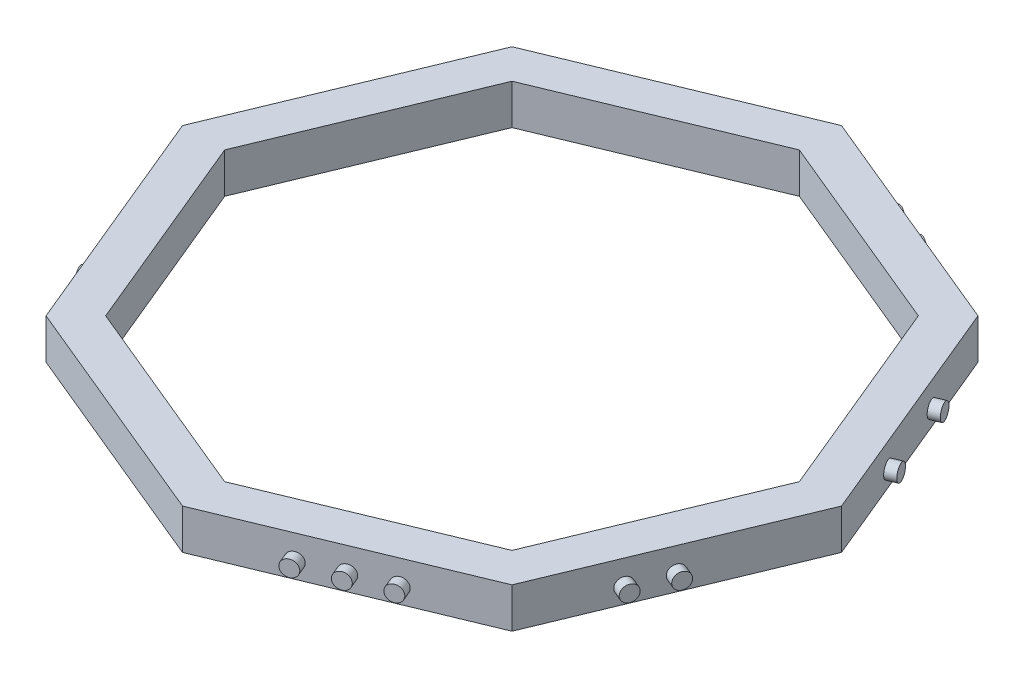
ISO-10303-21;
HEADER;
FILE_DESCRIPTION(('STEP AP214'),'2;1');
FILE_NAME('part.step','',(''),(''),'','','');
FILE_SCHEMA(('AUTOMOTIVE_DESIGN { 1 0 10303 214 1 1 1 1 }'));
ENDSEC;
DATA;
#1=APPLICATION_CONTEXT('core data for automotive mechanical design processes');
#2=APPLICATION_PROTOCOL_DEFINITION('international standard','automotive_design',2000,#1);
#3=PRODUCT_CONTEXT('',#1,'mechanical');
#4=PRODUCT('Part','Part','',(#3));
#5=PRODUCT_RELATED_PRODUCT_CATEGORY('part','',(#4));
#6=PRODUCT_DEFINITION_FORMATION('','',#4);
#7=PRODUCT_DEFINITION_CONTEXT('part definition',#1,'design');
#8=PRODUCT_DEFINITION('design','',#6,#7);
#9=PRODUCT_DEFINITION_SHAPE('','',#8);
#10=(LENGTH_UNIT() NAMED_UNIT(*) SI_UNIT(.MILLI.,.METRE.));
#11=(NAMED_UNIT(*) PLANE_ANGLE_UNIT() SI_UNIT($,.RADIAN.));
#12=(NAMED_UNIT(*) SI_UNIT($,.STERADIAN.) SOLID_ANGLE_UNIT());
#13=UNCERTAINTY_MEASURE_WITH_UNIT(LENGTH_MEASURE(1.E-05),#10,'distance_accuracy_value','');
#14=(GEOMETRIC_REPRESENTATION_CONTEXT(3) GLOBAL_UNCERTAINTY_ASSIGNED_CONTEXT((#13)) GLOBAL_UNIT_ASSIGNED_CONTEXT((#10,
#11,#12)) REPRESENTATION_CONTEXT('',''));
#15=CARTESIAN_POINT('',(0.,0.,0.));
#16=DIRECTION('',(0.,0.,1.));
#17=DIRECTION('',(1.,0.,0.));
#18=AXIS2_PLACEMENT_3D('',#15,#16,#17);
#19=CARTESIAN_POINT('',(28.9913780286488,5.,28.9913780286481));
#20=DIRECTION('',(-0.923879532511291,0.,-0.38268343236508));
#21=DIRECTION('',(-0.38268343236508,0.,0.923879532511291));
#22=AXIS2_PLACEMENT_3D('',#19,#20,#21);
#23=PLANE('',#22);
#24=CARTESIAN_POINT('',(34.9956890143244,2.,14.4956890143238));
#25=DIRECTION('',(-0.923879532511291,0.,-0.38268343236508));
#26=DIRECTION('',(-0.38268343236508,0.,0.923879532511291));
#27=AXIS2_PLACEMENT_3D('',#24,#25,#26);
#28=CIRCLE('',#27,1.);
#29=CARTESIAN_POINT('',(34.6130055819593,2.,15.4195685468351));
#30=VERTEX_POINT('',#29);
#31=EDGE_CURVE('E11',#30,#30,#28,.F.);
#32=ORIENTED_EDGE('',*,*,#31,.F.);
#33=EDGE_LOOP('',(#32));
#34=FACE_BOUND('',#33,.T.);
#35=CARTESIAN_POINT('',(33.082271852499,2.,19.1150866768803));
#36=DIRECTION('',(-0.923879532511291,0.,-0.38268343236508));
#37=DIRECTION('',(-0.38268343236508,0.,0.923879532511291));
#38=AXIS2_PLACEMENT_3D('',#35,#36,#37);
#39=CIRCLE('',#38,1.);
#40=CARTESIAN_POINT('',(32.6995884201339,2.,20.0389662093916));
#41=VERTEX_POINT('',#40);
#42=EDGE_CURVE('E40',#41,#41,#39,.F.);
#43=ORIENTED_EDGE('',*,*,#42,.F.);
#44=EDGE_LOOP('',(#43));
#45=FACE_BOUND('',#44,.T.);
#46=DIRECTION('',(0.38268343236508,0.,-0.923879532511291));
#47=VECTOR('',#46,1.);
#48=CARTESIAN_POINT('',(28.9913780286488,0.,28.9913780286481));
#49=LINE('',#48,#47);
#50=CARTESIAN_POINT('',(28.9913780286488,0.,28.9913780286481));
#51=VERTEX_POINT('',#50);
#52=CARTESIAN_POINT('',(41.,0.,-4.48023070960939E-13));
#53=VERTEX_POINT('',#52);
#54=EDGE_CURVE('E205',#51,#53,#49,.T.);
#55=ORIENTED_EDGE('',*,*,#54,.T.);
#56=DIRECTION('',(0.,-1.,0.));
#57=VECTOR('',#56,1.);
#58=CARTESIAN_POINT('',(41.,5.,-4.48023070960939E-13));
#59=LINE('',#58,#57);
#60=CARTESIAN_POINT('',(41.,5.,-4.48023070960939E-13));
#61=VERTEX_POINT('',#60);
#62=EDGE_CURVE('E271',#61,#53,#59,.T.);
#63=ORIENTED_EDGE('',*,*,#62,.F.);
#64=DIRECTION('',(0.38268343236508,0.,-0.923879532511291));
#65=VECTOR('',#64,1.);
#66=CARTESIAN_POINT('',(28.9913780286488,5.,28.9913780286481));
#67=LINE('',#66,#65);
#68=CARTESIAN_POINT('',(28.9913780286488,5.,28.9913780286481));
#69=VERTEX_POINT('',#68);
#70=EDGE_CURVE('E217',#69,#61,#67,.T.);
#71=ORIENTED_EDGE('',*,*,#70,.F.);
#72=DIRECTION('',(0.,-1.,0.));
#73=VECTOR('',#72,1.);
#74=CARTESIAN_POINT('',(28.9913780286488,5.,28.9913780286481));
#75=LINE('',#74,#73);
#76=EDGE_CURVE('E235',#69,#51,#75,.T.);
#77=ORIENTED_EDGE('',*,*,#76,.T.);
#78=EDGE_LOOP('',(#55,#63,#71,#77));
#79=FACE_BOUND('',#78,.T.);
#80=ADVANCED_FACE('F33',(#34,#45,#79),#23,.F.);
#81=CARTESIAN_POINT('',(41.,5.,-4.48023070960939E-13));
#82=DIRECTION('',(-0.923879532511283,0.,0.3826834323651));
#83=DIRECTION('',(0.3826834323651,0.,0.923879532511283));
#84=AXIS2_PLACEMENT_3D('',#81,#82,#83);
#85=PLANE('',#84);
#86=CARTESIAN_POINT('',(33.0822718524986,2.,-19.115086676881));
#87=DIRECTION('',(-0.923879532511283,0.,0.3826834323651));
#88=DIRECTION('',(0.3826834323651,0.,0.923879532511283));
#89=AXIS2_PLACEMENT_3D('',#86,#87,#88);
#90=CIRCLE('',#89,1.);
#91=CARTESIAN_POINT('',(33.4649552848637,2.,-18.1912071443697));
#92=VERTEX_POINT('',#91);
#93=EDGE_CURVE('E301',#92,#92,#90,.F.);
#94=ORIENTED_EDGE('',*,*,#93,.F.);
#95=EDGE_LOOP('',(#94));
#96=FACE_BOUND('',#95,.T.);
#97=CARTESIAN_POINT('',(36.9091061761496,2.,-9.8762913517682));
#98=DIRECTION('',(-0.923879532511283,0.,0.3826834323651));
#99=DIRECTION('',(0.3826834323651,0.,0.923879532511283));
#100=AXIS2_PLACEMENT_3D('',#97,#98,#99);
#101=CIRCLE('',#100,1.);
#102=CARTESIAN_POINT('',(37.2917896085147,2.,-8.95241181925691));
#103=VERTEX_POINT('',#102);
#104=EDGE_CURVE('E298',#103,#103,#101,.F.);
#105=ORIENTED_EDGE('',*,*,#104,.F.);
#106=EDGE_LOOP('',(#105));
#107=FACE_BOUND('',#106,.T.);
#108=DIRECTION('',(-0.3826834323651,0.,-0.923879532511283));
#109=VECTOR('',#108,1.);
#110=CARTESIAN_POINT('',(41.,0.,-4.48023070960939E-13));
#111=LINE('',#110,#109);
#112=CARTESIAN_POINT('',(28.9913780286481,0.,-28.9913780286488));
#113=VERTEX_POINT('',#112);
#114=EDGE_CURVE('E238',#53,#113,#111,.T.);
#115=ORIENTED_EDGE('',*,*,#114,.T.);
#116=DIRECTION('',(0.,-1.,0.));
#117=VECTOR('',#116,1.);
#118=CARTESIAN_POINT('',(28.9913780286481,5.,-28.9913780286488));
#119=LINE('',#118,#117);
#120=CARTESIAN_POINT('',(28.9913780286481,5.,-28.9913780286488));
#121=VERTEX_POINT('',#120);
#122=EDGE_CURVE('E268',#121,#113,#119,.T.);
#123=ORIENTED_EDGE('',*,*,#122,.F.);
#124=DIRECTION('',(-0.3826834323651,0.,-0.923879532511283));
#125=VECTOR('',#124,1.);
#126=CARTESIAN_POINT('',(41.,5.,-4.48023070960939E-13));
#127=LINE('',#126,#125);
#128=EDGE_CURVE('E220',#61,#121,#127,.T.);
#129=ORIENTED_EDGE('',*,*,#128,.F.);
#130=ORIENTED_EDGE('',*,*,#62,.T.);
#131=EDGE_LOOP('',(#115,#123,#129,#130));
#132=FACE_BOUND('',#131,.T.);
#133=ADVANCED_FACE('F310',(#96,#107,#132),#85,.F.);
#134=CARTESIAN_POINT('',(28.9913780286481,5.,-28.9913780286488));
#135=DIRECTION('',(-0.38268343236508,0.,0.923879532511291));
#136=DIRECTION('',(0.923879532511291,0.,0.38268343236508));
#137=AXIS2_PLACEMENT_3D('',#134,#135,#136);
#138=PLANE('',#137);
#139=CARTESIAN_POINT('',(9.87629135176739,2.,-36.9091061761498));
#140=DIRECTION('',(-0.38268343236508,0.,0.923879532511291));
#141=DIRECTION('',(0.923879532511291,0.,0.38268343236508));
#142=AXIS2_PLACEMENT_3D('',#139,#140,#141);
#143=CIRCLE('',#142,0.999999999999998);
#144=CARTESIAN_POINT('',(10.8001708842787,2.,-36.5264227437847));
#145=VERTEX_POINT('',#144);
#146=EDGE_CURVE('E295',#145,#145,#143,.F.);
#147=ORIENTED_EDGE('',*,*,#146,.F.);
#148=EDGE_LOOP('',(#147));
#149=FACE_BOUND('',#148,.T.);
#150=CARTESIAN_POINT('',(14.4956890143238,2.,-34.9956890143244));
#151=DIRECTION('',(-0.38268343236508,0.,0.923879532511291));
#152=DIRECTION('',(0.923879532511291,0.,0.38268343236508));
#153=AXIS2_PLACEMENT_3D('',#150,#151,#152);
#154=CIRCLE('',#153,1.);
#155=CARTESIAN_POINT('',(15.4195685468351,2.,-34.6130055819593));
#156=VERTEX_POINT('',#155);
#157=EDGE_CURVE('E292',#156,#156,#154,.F.);
#158=ORIENTED_EDGE('',*,*,#157,.F.);
#159=EDGE_LOOP('',(#158));
#160=FACE_BOUND('',#159,.T.);
#161=DIRECTION('',(-0.923879532511291,0.,-0.38268343236508));
#162=VECTOR('',#161,1.);
#163=CARTESIAN_POINT('',(28.9913780286481,0.,-28.9913780286488));
#164=LINE('',#163,#162);
#165=CARTESIAN_POINT('',(-4.51771650624012E-13,0.,-41.));
#166=VERTEX_POINT('',#165);
#167=EDGE_CURVE('E240',#113,#166,#164,.T.);
#168=ORIENTED_EDGE('',*,*,#167,.T.);
#169=DIRECTION('',(0.,-1.,0.));
#170=VECTOR('',#169,1.);
#171=CARTESIAN_POINT('',(-4.51771650624012E-13,5.,-41.));
#172=LINE('',#171,#170);
#173=CARTESIAN_POINT('',(-4.51771650624012E-13,5.,-41.));
#174=VERTEX_POINT('',#173);
#175=EDGE_CURVE('E265',#174,#166,#172,.T.);
#176=ORIENTED_EDGE('',*,*,#175,.F.);
#177=DIRECTION('',(-0.923879532511291,0.,-0.38268343236508));
#178=VECTOR('',#177,1.);
#179=CARTESIAN_POINT('',(28.9913780286481,5.,-28.9913780286488));
#180=LINE('',#179,#178);
#181=EDGE_CURVE('E223',#121,#174,#180,.T.);
#182=ORIENTED_EDGE('',*,*,#181,.F.);
#183=ORIENTED_EDGE('',*,*,#122,.T.);
#184=EDGE_LOOP('',(#168,#176,#182,#183));
#185=FACE_BOUND('',#184,.T.);
#186=ADVANCED_FACE('F348',(#149,#160,#185),#138,.F.);
#187=CARTESIAN_POINT('',(-4.51771650624012E-13,5.,-41.));
#188=DIRECTION('',(0.3826834323651,0.,0.923879532511283));
#189=DIRECTION('',(0.923879532511283,0.,-0.3826834323651));
#190=AXIS2_PLACEMENT_3D('',#187,#188,#189);
#191=PLANE('',#190);
#192=CARTESIAN_POINT('',(-9.8762913517682,2.,-36.9091061761496));
#193=DIRECTION('',(0.3826834323651,0.,0.923879532511283));
#194=DIRECTION('',(0.923879532511283,0.,-0.3826834323651));
#195=AXIS2_PLACEMENT_3D('',#192,#193,#194);
#196=CIRCLE('',#195,1.);
#197=CARTESIAN_POINT('',(-8.95241181925692,2.,-37.2917896085147));
#198=VERTEX_POINT('',#197);
#199=EDGE_CURVE('E289',#198,#198,#196,.F.);
#200=ORIENTED_EDGE('',*,*,#199,.F.);
#201=EDGE_LOOP('',(#200));
#202=FACE_BOUND('',#201,.T.);
#203=DIRECTION('',(-0.923879532511283,0.,0.3826834323651));
#204=VECTOR('',#203,1.);
#205=CARTESIAN_POINT('',(-4.51771650624012E-13,0.,-41.));
#206=LINE('',#205,#204);
#207=CARTESIAN_POINT('',(-28.9913780286488,0.,-28.9913780286481));
#208=VERTEX_POINT('',#207);
#209=EDGE_CURVE('E242',#166,#208,#206,.T.);
#210=ORIENTED_EDGE('',*,*,#209,.T.);
#211=DIRECTION('',(0.,-1.,0.));
#212=VECTOR('',#211,1.);
#213=CARTESIAN_POINT('',(-28.9913780286488,5.,-28.9913780286481));
#214=LINE('',#213,#212);
#215=CARTESIAN_POINT('',(-28.9913780286488,5.,-28.9913780286481));
#216=VERTEX_POINT('',#215);
#217=EDGE_CURVE('E262',#216,#208,#214,.T.);
#218=ORIENTED_EDGE('',*,*,#217,.F.);
#219=DIRECTION('',(-0.923879532511283,0.,0.3826834323651));
#220=VECTOR('',#219,1.);
#221=CARTESIAN_POINT('',(-4.51771650624012E-13,5.,-41.));
#222=LINE('',#221,#220);
#223=EDGE_CURVE('E225',#174,#216,#222,.T.);
#224=ORIENTED_EDGE('',*,*,#223,.F.);
#225=ORIENTED_EDGE('',*,*,#175,.T.);
#226=EDGE_LOOP('',(#210,#218,#224,#225));
#227=FACE_BOUND('',#226,.T.);
#228=ADVANCED_FACE('F345',(#202,#227),#191,.F.);
#229=CARTESIAN_POINT('',(-28.9913780286488,5.,-28.9913780286481));
#230=DIRECTION('',(0.923879532511291,0.,0.38268343236508));
#231=DIRECTION('',(0.38268343236508,0.,-0.923879532511291));
#232=AXIS2_PLACEMENT_3D('',#229,#230,#231);
#233=PLANE('',#232);
#234=CARTESIAN_POINT('',(-34.9956890143244,2.,-14.4956890143239));
#235=DIRECTION('',(0.923879532511291,0.,0.38268343236508));
#236=DIRECTION('',(0.38268343236508,0.,-0.923879532511291));
#237=AXIS2_PLACEMENT_3D('',#234,#235,#236);
#238=CIRCLE('',#237,0.999999999999998);
#239=CARTESIAN_POINT('',(-34.6130055819593,2.,-15.4195685468351));
#240=VERTEX_POINT('',#239);
#241=EDGE_CURVE('E286',#240,#240,#238,.F.);
#242=ORIENTED_EDGE('',*,*,#241,.F.);
#243=EDGE_LOOP('',(#242));
#244=FACE_BOUND('',#243,.T.);
#245=DIRECTION('',(-0.38268343236508,0.,0.923879532511291));
#246=VECTOR('',#245,1.);
#247=CARTESIAN_POINT('',(-28.9913780286488,0.,-28.9913780286481));
#248=LINE('',#247,#246);
#249=CARTESIAN_POINT('',(-41.,0.,4.3736829323662E-13));
#250=VERTEX_POINT('',#249);
#251=EDGE_CURVE('E244',#208,#250,#248,.T.);
#252=ORIENTED_EDGE('',*,*,#251,.T.);
#253=DIRECTION('',(0.,-1.,0.));
#254=VECTOR('',#253,1.);
#255=CARTESIAN_POINT('',(-41.,5.,4.3736829323662E-13));
#256=LINE('',#255,#254);
#257=CARTESIAN_POINT('',(-41.,5.,4.3736829323662E-13));
#258=VERTEX_POINT('',#257);
#259=EDGE_CURVE('E259',#258,#250,#256,.T.);
#260=ORIENTED_EDGE('',*,*,#259,.F.);
#261=DIRECTION('',(-0.38268343236508,0.,0.923879532511291));
#262=VECTOR('',#261,1.);
#263=CARTESIAN_POINT('',(-28.9913780286488,5.,-28.9913780286481));
#264=LINE('',#263,#262);
#265=EDGE_CURVE('E227',#216,#258,#264,.T.);
#266=ORIENTED_EDGE('',*,*,#265,.F.);
#267=ORIENTED_EDGE('',*,*,#217,.T.);
#268=EDGE_LOOP('',(#252,#260,#266,#267));
#269=FACE_BOUND('',#268,.T.);
#270=ADVANCED_FACE('F341',(#244,#269),#233,.F.);
#271=CARTESIAN_POINT('',(-41.,5.,4.3736829323662E-13));
#272=DIRECTION('',(0.923879532511283,0.,-0.3826834323651));
#273=DIRECTION('',(-0.3826834323651,0.,-0.923879532511283));
#274=AXIS2_PLACEMENT_3D('',#271,#272,#273);
#275=PLANE('',#274);
#276=CARTESIAN_POINT('',(-33.0822718524986,2.,19.115086676881));
#277=DIRECTION('',(0.923879532511283,0.,-0.3826834323651));
#278=DIRECTION('',(-0.3826834323651,0.,-0.923879532511283));
#279=AXIS2_PLACEMENT_3D('',#276,#277,#278);
#280=CIRCLE('',#279,1.);
#281=CARTESIAN_POINT('',(-33.4649552848637,2.,18.1912071443697));
#282=VERTEX_POINT('',#281);
#283=EDGE_CURVE('E283',#282,#282,#280,.F.);
#284=ORIENTED_EDGE('',*,*,#283,.F.);
#285=EDGE_LOOP('',(#284));
#286=FACE_BOUND('',#285,.T.);
#287=DIRECTION('',(0.3826834323651,0.,0.923879532511283));
#288=VECTOR('',#287,1.);
#289=CARTESIAN_POINT('',(-41.,0.,4.3736829323662E-13));
#290=LINE('',#289,#288);
#291=CARTESIAN_POINT('',(-28.9913780286481,0.,28.9913780286488));
#292=VERTEX_POINT('',#291);
#293=EDGE_CURVE('E246',#250,#292,#290,.T.);
#294=ORIENTED_EDGE('',*,*,#293,.T.);
#295=DIRECTION('',(0.,-1.,0.));
#296=VECTOR('',#295,1.);
#297=CARTESIAN_POINT('',(-28.9913780286481,5.,28.9913780286488));
#298=LINE('',#297,#296);
#299=CARTESIAN_POINT('',(-28.9913780286481,5.,28.9913780286488));
#300=VERTEX_POINT('',#299);
#301=EDGE_CURVE('E256',#300,#292,#298,.T.);
#302=ORIENTED_EDGE('',*,*,#301,.F.);
#303=DIRECTION('',(0.3826834323651,0.,0.923879532511283));
#304=VECTOR('',#303,1.);
#305=CARTESIAN_POINT('',(-41.,5.,4.3736829323662E-13));
#306=LINE('',#305,#304);
#307=EDGE_CURVE('E229',#258,#300,#306,.T.);
#308=ORIENTED_EDGE('',*,*,#307,.F.);
#309=ORIENTED_EDGE('',*,*,#259,.T.);
#310=EDGE_LOOP('',(#294,#302,#308,#309));
#311=FACE_BOUND('',#310,.T.);
#312=ADVANCED_FACE('F336',(#286,#311),#275,.F.);
#313=CARTESIAN_POINT('',(-28.9913780286481,5.,28.9913780286488));
#314=DIRECTION('',(0.382683432365079,0.,-0.923879532511291));
#315=DIRECTION('',(-0.923879532511291,0.,-0.382683432365079));
#316=AXIS2_PLACEMENT_3D('',#313,#314,#315);
#317=PLANE('',#316);
#318=DIRECTION('',(0.923879532511291,0.,0.382683432365079));
#319=VECTOR('',#318,1.);
#320=CARTESIAN_POINT('',(-28.9913780286481,0.,28.9913780286488));
#321=LINE('',#320,#319);
#322=CARTESIAN_POINT('',(4.40747933146162E-13,0.,41.));
#323=VERTEX_POINT('',#322);
#324=EDGE_CURVE('E248',#292,#323,#321,.T.);
#325=ORIENTED_EDGE('',*,*,#324,.T.);
#326=DIRECTION('',(0.,-1.,0.));
#327=VECTOR('',#326,1.);
#328=CARTESIAN_POINT('',(4.40747933146162E-13,5.,41.));
#329=LINE('',#328,#327);
#330=CARTESIAN_POINT('',(4.40747933146162E-13,5.,41.));
#331=VERTEX_POINT('',#330);
#332=EDGE_CURVE('E253',#331,#323,#329,.T.);
#333=ORIENTED_EDGE('',*,*,#332,.F.);
#334=DIRECTION('',(0.923879532511291,0.,0.382683432365079));
#335=VECTOR('',#334,1.);
#336=CARTESIAN_POINT('',(-28.9913780286481,5.,28.9913780286488));
#337=LINE('',#336,#335);
#338=EDGE_CURVE('E231',#300,#331,#337,.T.);
#339=ORIENTED_EDGE('',*,*,#338,.F.);
#340=ORIENTED_EDGE('',*,*,#301,.T.);
#341=EDGE_LOOP('',(#325,#333,#339,#340));
#342=FACE_BOUND('',#341,.T.);
#343=ADVANCED_FACE('F331',(#342),#317,.F.);
#344=CARTESIAN_POINT('',(4.40747933146162E-13,5.,41.));
#345=DIRECTION('',(-0.3826834323651,0.,-0.923879532511283));
#346=DIRECTION('',(-0.923879532511283,0.,0.3826834323651));
#347=AXIS2_PLACEMENT_3D('',#344,#345,#346);
#348=PLANE('',#347);
#349=CARTESIAN_POINT('',(14.4956890143246,2.,34.9956890143241));
#350=DIRECTION('',(-0.3826834323651,0.,-0.923879532511283));
#351=DIRECTION('',(-0.923879532511283,0.,0.3826834323651));
#352=AXIS2_PLACEMENT_3D('',#349,#350,#351);
#353=CIRCLE('',#352,1.);
#354=CARTESIAN_POINT('',(13.5718094818133,2.,35.3783724466892));
#355=VERTEX_POINT('',#354);
#356=EDGE_CURVE('E280',#355,#355,#353,.F.);
#357=ORIENTED_EDGE('',*,*,#356,.F.);
#358=EDGE_LOOP('',(#357));
#359=FACE_BOUND('',#358,.T.);
#360=CARTESIAN_POINT('',(9.87629135176818,2.,36.9091061761496));
#361=DIRECTION('',(-0.3826834323651,0.,-0.923879532511283));
#362=DIRECTION('',(-0.923879532511283,0.,0.3826834323651));
#363=AXIS2_PLACEMENT_3D('',#360,#361,#362);
#364=CIRCLE('',#363,1.);
#365=CARTESIAN_POINT('',(8.9524118192569,2.,37.2917896085147));
#366=VERTEX_POINT('',#365);
#367=EDGE_CURVE('E277',#366,#366,#364,.F.);
#368=ORIENTED_EDGE('',*,*,#367,.F.);
#369=EDGE_LOOP('',(#368));
#370=FACE_BOUND('',#369,.T.);
#371=CARTESIAN_POINT('',(19.115086676881,2.,33.0822718524986));
#372=DIRECTION('',(-0.3826834323651,0.,-0.923879532511283));
#373=DIRECTION('',(-0.923879532511283,0.,0.3826834323651));
#374=AXIS2_PLACEMENT_3D('',#371,#372,#373);
#375=CIRCLE('',#374,1.);
#376=CARTESIAN_POINT('',(18.1912071443697,2.,33.4649552848637));
#377=VERTEX_POINT('',#376);
#378=EDGE_CURVE('E274',#377,#377,#375,.F.);
#379=ORIENTED_EDGE('',*,*,#378,.F.);
#380=EDGE_LOOP('',(#379));
#381=FACE_BOUND('',#380,.T.);
#382=DIRECTION('',(0.923879532511283,0.,-0.3826834323651));
#383=VECTOR('',#382,1.);
#384=CARTESIAN_POINT('',(4.40747933146162E-13,0.,41.));
#385=LINE('',#384,#383);
#386=EDGE_CURVE('E221',#323,#51,#385,.T.);
#387=ORIENTED_EDGE('',*,*,#386,.T.);
#388=ORIENTED_EDGE('',*,*,#76,.F.);
#389=DIRECTION('',(0.923879532511283,0.,-0.3826834323651));
#390=VECTOR('',#389,1.);
#391=CARTESIAN_POINT('',(4.40747933146162E-13,5.,41.));
#392=LINE('',#391,#390);
#393=EDGE_CURVE('E233',#331,#69,#392,.T.);
#394=ORIENTED_EDGE('',*,*,#393,.F.);
#395=ORIENTED_EDGE('',*,*,#332,.T.);
#396=EDGE_LOOP('',(#387,#388,#394,#395));
#397=FACE_BOUND('',#396,.T.);
#398=ADVANCED_FACE('F329',(#359,#370,#381,#397),#348,.F.);
#399=CARTESIAN_POINT('',(0.,5.,0.));
#400=DIRECTION('',(0.,1.,0.));
#401=DIRECTION('',(0.,0.,1.));
#402=AXIS2_PLACEMENT_3D('',#399,#400,#401);
#403=PLANE('',#402);
#404=DIRECTION('',(0.382683432365079,0.,-0.923879532511291));
#405=VECTOR('',#404,1.);
#406=CARTESIAN_POINT('',(25.2790674274194,5.,25.2790674274188));
#407=LINE('',#406,#405);
#408=CARTESIAN_POINT('',(25.2790674274194,5.,25.2790674274188));
#409=VERTEX_POINT('',#408);
#410=CARTESIAN_POINT('',(35.75,5.,-4.16333634234434E-13));
#411=VERTEX_POINT('',#410);
#412=EDGE_CURVE('E47',#409,#411,#407,.T.);
#413=ORIENTED_EDGE('',*,*,#412,.F.);
#414=DIRECTION('',(0.923879532511282,0.,-0.3826834323651));
#415=VECTOR('',#414,1.);
#416=CARTESIAN_POINT('',(4.16333753560652E-13,5.,35.75));
#417=LINE('',#416,#415);
#418=CARTESIAN_POINT('',(4.16333753560652E-13,5.,35.75));
#419=VERTEX_POINT('',#418);
#420=EDGE_CURVE('E164',#419,#409,#417,.T.);
#421=ORIENTED_EDGE('',*,*,#420,.F.);
#422=DIRECTION('',(0.923879532511291,0.,0.382683432365079));
#423=VECTOR('',#422,1.);
#424=CARTESIAN_POINT('',(-25.2790674274188,5.,25.2790674274194));
#425=LINE('',#424,#423);
#426=CARTESIAN_POINT('',(-25.2790674274188,5.,25.2790674274194));
#427=VERTEX_POINT('',#426);
#428=EDGE_CURVE('E167',#427,#419,#425,.T.);
#429=ORIENTED_EDGE('',*,*,#428,.F.);
#430=DIRECTION('',(0.3826834323651,0.,0.923879532511283));
#431=VECTOR('',#430,1.);
#432=CARTESIAN_POINT('',(-35.75,5.,4.19807521561603E-13));
#433=LINE('',#432,#431);
#434=CARTESIAN_POINT('',(-35.75,5.,4.19807521561603E-13));
#435=VERTEX_POINT('',#434);
#436=EDGE_CURVE('E198',#435,#427,#433,.T.);
#437=ORIENTED_EDGE('',*,*,#436,.F.);
#438=DIRECTION('',(-0.382683432365079,0.,0.923879532511291));
#439=VECTOR('',#438,1.);
#440=CARTESIAN_POINT('',(-25.2790674274194,5.,-25.2790674274188));
#441=LINE('',#440,#439);
#442=CARTESIAN_POINT('',(-25.2790674274194,5.,-25.2790674274188));
#443=VERTEX_POINT('',#442);
#444=EDGE_CURVE('E195',#443,#435,#441,.T.);
#445=ORIENTED_EDGE('',*,*,#444,.F.);
#446=DIRECTION('',(-0.923879532511282,0.,0.3826834323651));
#447=VECTOR('',#446,1.);
#448=CARTESIAN_POINT('',(-4.23301906745794E-13,5.,-35.75));
#449=LINE('',#448,#447);
#450=CARTESIAN_POINT('',(-4.23301906745794E-13,5.,-35.75));
#451=VERTEX_POINT('',#450);
#452=EDGE_CURVE('E192',#451,#443,#449,.T.);
#453=ORIENTED_EDGE('',*,*,#452,.F.);
#454=DIRECTION('',(-0.923879532511291,0.,-0.382683432365079));
#455=VECTOR('',#454,1.);
#456=CARTESIAN_POINT('',(25.2790674274188,5.,-25.2790674274194));
#457=LINE('',#456,#455);
#458=CARTESIAN_POINT('',(25.2790674274188,5.,-25.2790674274194));
#459=VERTEX_POINT('',#458);
#460=EDGE_CURVE('E189',#459,#451,#457,.T.);
#461=ORIENTED_EDGE('',*,*,#460,.F.);
#462=DIRECTION('',(-0.3826834323651,0.,-0.923879532511282));
#463=VECTOR('',#462,1.);
#464=CARTESIAN_POINT('',(35.75,5.,-4.15771681559117E-13));
#465=LINE('',#464,#463);
#466=EDGE_CURVE('E187',#411,#459,#465,.T.);
#467=ORIENTED_EDGE('',*,*,#466,.F.);
#468=EDGE_LOOP('',(#413,#421,#429,#437,#445,#453,#461,#467));
#469=FACE_BOUND('',#468,.T.);
#470=ORIENTED_EDGE('',*,*,#70,.T.);
#471=ORIENTED_EDGE('',*,*,#128,.T.);
#472=ORIENTED_EDGE('',*,*,#181,.T.);
#473=ORIENTED_EDGE('',*,*,#223,.T.);
#474=ORIENTED_EDGE('',*,*,#265,.T.);
#475=ORIENTED_EDGE('',*,*,#307,.T.);
#476=ORIENTED_EDGE('',*,*,#338,.T.);
#477=ORIENTED_EDGE('',*,*,#393,.T.);
#478=EDGE_LOOP('',(#470,#471,#472,#473,#474,#475,#476,#477));
#479=FACE_BOUND('',#478,.T.);
#480=ADVANCED_FACE('F324',(#469,#479),#403,.T.);
#481=CARTESIAN_POINT('',(0.,0.,0.));
#482=DIRECTION('',(0.,1.,0.));
#483=DIRECTION('',(0.,0.,1.));
#484=AXIS2_PLACEMENT_3D('',#481,#482,#483);
#485=PLANE('',#484);
#486=DIRECTION('',(0.923879532511282,0.,-0.3826834323651));
#487=VECTOR('',#486,1.);
#488=CARTESIAN_POINT('',(4.16333753560652E-13,0.,35.75));
#489=LINE('',#488,#487);
#490=CARTESIAN_POINT('',(4.16333753560652E-13,0.,35.75));
#491=VERTEX_POINT('',#490);
#492=CARTESIAN_POINT('',(25.2790674274194,0.,25.2790674274188));
#493=VERTEX_POINT('',#492);
#494=EDGE_CURVE('E153',#491,#493,#489,.T.);
#495=ORIENTED_EDGE('',*,*,#494,.T.);
#496=DIRECTION('',(0.382683432365079,0.,-0.923879532511291));
#497=VECTOR('',#496,1.);
#498=CARTESIAN_POINT('',(25.2790674274194,0.,25.2790674274188));
#499=LINE('',#498,#497);
#500=CARTESIAN_POINT('',(35.75,0.,-4.15771681559117E-13));
#501=VERTEX_POINT('',#500);
#502=EDGE_CURVE('E147',#493,#501,#499,.T.);
#503=ORIENTED_EDGE('',*,*,#502,.T.);
#504=DIRECTION('',(-0.3826834323651,0.,-0.923879532511282));
#505=VECTOR('',#504,1.);
#506=CARTESIAN_POINT('',(35.75,0.,-4.15771681559117E-13));
#507=LINE('',#506,#505);
#508=CARTESIAN_POINT('',(25.2790674274188,0.,-25.2790674274194));
#509=VERTEX_POINT('',#508);
#510=EDGE_CURVE('E156',#501,#509,#507,.T.);
#511=ORIENTED_EDGE('',*,*,#510,.T.);
#512=DIRECTION('',(-0.923879532511291,0.,-0.382683432365079));
#513=VECTOR('',#512,1.);
#514=CARTESIAN_POINT('',(25.2790674274188,0.,-25.2790674274194));
#515=LINE('',#514,#513);
#516=CARTESIAN_POINT('',(-4.23301906745794E-13,0.,-35.75));
#517=VERTEX_POINT('',#516);
#518=EDGE_CURVE('E55',#509,#517,#515,.T.);
#519=ORIENTED_EDGE('',*,*,#518,.T.);
#520=DIRECTION('',(-0.923879532511282,0.,0.3826834323651));
#521=VECTOR('',#520,1.);
#522=CARTESIAN_POINT('',(-4.23301906745794E-13,0.,-35.75));
#523=LINE('',#522,#521);
#524=CARTESIAN_POINT('',(-25.2790674274194,0.,-25.2790674274188));
#525=VERTEX_POINT('',#524);
#526=EDGE_CURVE('E174',#517,#525,#523,.T.);
#527=ORIENTED_EDGE('',*,*,#526,.T.);
#528=DIRECTION('',(-0.382683432365079,0.,0.923879532511291));
#529=VECTOR('',#528,1.);
#530=CARTESIAN_POINT('',(-25.2790674274194,0.,-25.2790674274188));
#531=LINE('',#530,#529);
#532=CARTESIAN_POINT('',(-35.75,0.,4.19807521561603E-13));
#533=VERTEX_POINT('',#532);
#534=EDGE_CURVE('E177',#525,#533,#531,.T.);
#535=ORIENTED_EDGE('',*,*,#534,.T.);
#536=DIRECTION('',(0.3826834323651,0.,0.923879532511283));
#537=VECTOR('',#536,1.);
#538=CARTESIAN_POINT('',(-35.75,0.,4.19807521561603E-13));
#539=LINE('',#538,#537);
#540=CARTESIAN_POINT('',(-25.2790674274188,0.,25.2790674274194));
#541=VERTEX_POINT('',#540);
#542=EDGE_CURVE('E180',#533,#541,#539,.T.);
#543=ORIENTED_EDGE('',*,*,#542,.T.);
#544=DIRECTION('',(0.923879532511291,0.,0.382683432365079));
#545=VECTOR('',#544,1.);
#546=CARTESIAN_POINT('',(-25.2790674274188,0.,25.2790674274194));
#547=LINE('',#546,#545);
#548=EDGE_CURVE('E183',#541,#491,#547,.T.);
#549=ORIENTED_EDGE('',*,*,#548,.T.);
#550=EDGE_LOOP('',(#495,#503,#511,#519,#527,#535,#543,#549));
#551=FACE_BOUND('',#550,.T.);
#552=ORIENTED_EDGE('',*,*,#54,.F.);
#553=ORIENTED_EDGE('',*,*,#386,.F.);
#554=ORIENTED_EDGE('',*,*,#324,.F.);
#555=ORIENTED_EDGE('',*,*,#293,.F.);
#556=ORIENTED_EDGE('',*,*,#251,.F.);
#557=ORIENTED_EDGE('',*,*,#209,.F.);
#558=ORIENTED_EDGE('',*,*,#167,.F.);
#559=ORIENTED_EDGE('',*,*,#114,.F.);
#560=EDGE_LOOP('',(#552,#553,#554,#555,#556,#557,#558,#559));
#561=FACE_BOUND('',#560,.T.);
#562=ADVANCED_FACE('F160',(#551,#561),#485,.F.);
#563=CARTESIAN_POINT('',(25.2790674274194,0.,25.2790674274188));
#564=DIRECTION('',(0.923879532511291,0.,0.382683432365079));
#565=DIRECTION('',(0.382683432365079,0.,-0.923879532511291));
#566=AXIS2_PLACEMENT_3D('',#563,#564,#565);
#567=PLANE('',#566);
#568=ORIENTED_EDGE('',*,*,#412,.T.);
#569=DIRECTION('',(0.,1.,0.));
#570=VECTOR('',#569,1.);
#571=CARTESIAN_POINT('',(35.75,0.,-4.15771681559117E-13));
#572=LINE('',#571,#570);
#573=EDGE_CURVE('E143',#501,#411,#572,.T.);
#574=ORIENTED_EDGE('',*,*,#573,.F.);
#575=ORIENTED_EDGE('',*,*,#502,.F.);
#576=DIRECTION('',(0.,1.,0.));
#577=VECTOR('',#576,1.);
#578=CARTESIAN_POINT('',(25.2790674274194,0.,25.2790674274188));
#579=LINE('',#578,#577);
#580=EDGE_CURVE('E203',#493,#409,#579,.T.);
#581=ORIENTED_EDGE('',*,*,#580,.T.);
#582=EDGE_LOOP('',(#568,#574,#575,#581));
#583=FACE_BOUND('',#582,.T.);
#584=ADVANCED_FACE('F145',(#583),#567,.F.);
#585=CARTESIAN_POINT('',(4.16333753560652E-13,0.,35.75));
#586=DIRECTION('',(0.3826834323651,0.,0.923879532511282));
#587=DIRECTION('',(0.923879532511282,0.,-0.3826834323651));
#588=AXIS2_PLACEMENT_3D('',#585,#586,#587);
#589=PLANE('',#588);
#590=ORIENTED_EDGE('',*,*,#420,.T.);
#591=ORIENTED_EDGE('',*,*,#580,.F.);
#592=ORIENTED_EDGE('',*,*,#494,.F.);
#593=DIRECTION('',(0.,1.,0.));
#594=VECTOR('',#593,1.);
#595=CARTESIAN_POINT('',(4.16333753560652E-13,0.,35.75));
#596=LINE('',#595,#594);
#597=EDGE_CURVE('E206',#491,#419,#596,.T.);
#598=ORIENTED_EDGE('',*,*,#597,.T.);
#599=EDGE_LOOP('',(#590,#591,#592,#598));
#600=FACE_BOUND('',#599,.T.);
#601=ADVANCED_FACE('F380',(#600),#589,.F.);
#602=CARTESIAN_POINT('',(-25.2790674274188,0.,25.2790674274194));
#603=DIRECTION('',(-0.382683432365079,0.,0.923879532511291));
#604=DIRECTION('',(0.923879532511291,0.,0.382683432365079));
#605=AXIS2_PLACEMENT_3D('',#602,#603,#604);
#606=PLANE('',#605);
#607=ORIENTED_EDGE('',*,*,#428,.T.);
#608=ORIENTED_EDGE('',*,*,#597,.F.);
#609=ORIENTED_EDGE('',*,*,#548,.F.);
#610=DIRECTION('',(0.,1.,0.));
#611=VECTOR('',#610,1.);
#612=CARTESIAN_POINT('',(-25.2790674274188,0.,25.2790674274194));
#613=LINE('',#612,#611);
#614=EDGE_CURVE('E208',#541,#427,#613,.T.);
#615=ORIENTED_EDGE('',*,*,#614,.T.);
#616=EDGE_LOOP('',(#607,#608,#609,#615));
#617=FACE_BOUND('',#616,.T.);
#618=ADVANCED_FACE('F398',(#617),#606,.F.);
#619=CARTESIAN_POINT('',(-35.75,0.,4.19807521561603E-13));
#620=DIRECTION('',(-0.923879532511282,0.,0.3826834323651));
#621=DIRECTION('',(0.3826834323651,0.,0.923879532511282));
#622=AXIS2_PLACEMENT_3D('',#619,#620,#621);
#623=PLANE('',#622);
#624=ORIENTED_EDGE('',*,*,#436,.T.);
#625=ORIENTED_EDGE('',*,*,#614,.F.);
#626=ORIENTED_EDGE('',*,*,#542,.F.);
#627=DIRECTION('',(0.,1.,0.));
#628=VECTOR('',#627,1.);
#629=CARTESIAN_POINT('',(-35.75,0.,4.19807521561603E-13));
#630=LINE('',#629,#628);
#631=EDGE_CURVE('E210',#533,#435,#630,.T.);
#632=ORIENTED_EDGE('',*,*,#631,.T.);
#633=EDGE_LOOP('',(#624,#625,#626,#632));
#634=FACE_BOUND('',#633,.T.);
#635=ADVANCED_FACE('F394',(#634),#623,.F.);
#636=CARTESIAN_POINT('',(-25.2790674274194,0.,-25.2790674274188));
#637=DIRECTION('',(-0.923879532511291,0.,-0.382683432365079));
#638=DIRECTION('',(-0.382683432365079,0.,0.923879532511291));
#639=AXIS2_PLACEMENT_3D('',#636,#637,#638);
#640=PLANE('',#639);
#641=ORIENTED_EDGE('',*,*,#444,.T.);
#642=ORIENTED_EDGE('',*,*,#631,.F.);
#643=ORIENTED_EDGE('',*,*,#534,.F.);
#644=DIRECTION('',(0.,1.,0.));
#645=VECTOR('',#644,1.);
#646=CARTESIAN_POINT('',(-25.2790674274194,0.,-25.2790674274188));
#647=LINE('',#646,#645);
#648=EDGE_CURVE('E212',#525,#443,#647,.T.);
#649=ORIENTED_EDGE('',*,*,#648,.T.);
#650=EDGE_LOOP('',(#641,#642,#643,#649));
#651=FACE_BOUND('',#650,.T.);
#652=ADVANCED_FACE('F390',(#651),#640,.F.);
#653=CARTESIAN_POINT('',(-4.23301906745794E-13,0.,-35.75));
#654=DIRECTION('',(-0.3826834323651,0.,-0.923879532511282));
#655=DIRECTION('',(-0.923879532511283,0.,0.3826834323651));
#656=AXIS2_PLACEMENT_3D('',#653,#654,#655);
#657=PLANE('',#656);
#658=ORIENTED_EDGE('',*,*,#452,.T.);
#659=ORIENTED_EDGE('',*,*,#648,.F.);
#660=ORIENTED_EDGE('',*,*,#526,.F.);
#661=DIRECTION('',(0.,1.,0.));
#662=VECTOR('',#661,1.);
#663=CARTESIAN_POINT('',(-4.23301906745794E-13,0.,-35.75));
#664=LINE('',#663,#662);
#665=EDGE_CURVE('E214',#517,#451,#664,.T.);
#666=ORIENTED_EDGE('',*,*,#665,.T.);
#667=EDGE_LOOP('',(#658,#659,#660,#666));
#668=FACE_BOUND('',#667,.T.);
#669=ADVANCED_FACE('F387',(#668),#657,.F.);
#670=CARTESIAN_POINT('',(25.2790674274188,0.,-25.2790674274194));
#671=DIRECTION('',(0.382683432365079,0.,-0.923879532511291));
#672=DIRECTION('',(-0.923879532511291,0.,-0.382683432365079));
#673=AXIS2_PLACEMENT_3D('',#670,#671,#672);
#674=PLANE('',#673);
#675=ORIENTED_EDGE('',*,*,#460,.T.);
#676=ORIENTED_EDGE('',*,*,#665,.F.);
#677=ORIENTED_EDGE('',*,*,#518,.F.);
#678=DIRECTION('',(0.,1.,0.));
#679=VECTOR('',#678,1.);
#680=CARTESIAN_POINT('',(25.2790674274188,0.,-25.2790674274194));
#681=LINE('',#680,#679);
#682=EDGE_CURVE('E152',#509,#459,#681,.T.);
#683=ORIENTED_EDGE('',*,*,#682,.T.);
#684=EDGE_LOOP('',(#675,#676,#677,#683));
#685=FACE_BOUND('',#684,.T.);
#686=ADVANCED_FACE('F384',(#685),#674,.F.);
#687=CARTESIAN_POINT('',(35.75,0.,-4.15771681559117E-13));
#688=DIRECTION('',(0.923879532511282,0.,-0.3826834323651));
#689=DIRECTION('',(-0.3826834323651,0.,-0.923879532511283));
#690=AXIS2_PLACEMENT_3D('',#687,#688,#689);
#691=PLANE('',#690);
#692=ORIENTED_EDGE('',*,*,#466,.T.);
#693=ORIENTED_EDGE('',*,*,#682,.F.);
#694=ORIENTED_EDGE('',*,*,#510,.F.);
#695=ORIENTED_EDGE('',*,*,#573,.T.);
#696=EDGE_LOOP('',(#692,#693,#694,#695));
#697=FACE_BOUND('',#696,.T.);
#698=ADVANCED_FACE('F157',(#697),#691,.F.);
#699=CARTESIAN_POINT('',(19.5934409673374,2.,34.2371212681377));
#700=DIRECTION('',(-0.3826834323651,0.,-0.923879532511283));
#701=DIRECTION('',(-0.923879532511283,0.,0.3826834323651));
#702=AXIS2_PLACEMENT_3D('',#699,#700,#701);
#703=CYLINDRICAL_SURFACE('',#702,1.);
#704=CARTESIAN_POINT('',(19.5934409673374,2.,34.2371212681377));
#705=DIRECTION('',(0.3826834323651,0.,0.923879532511283));
#706=DIRECTION('',(0.923879532511283,0.,-0.3826834323651));
#707=AXIS2_PLACEMENT_3D('',#704,#705,#706);
#708=CIRCLE('',#707,1.);
#709=CARTESIAN_POINT('',(20.5173204998487,2.,33.8544378357726));
#710=VERTEX_POINT('',#709);
#711=EDGE_CURVE('E170',#710,#710,#708,.T.);
#712=ORIENTED_EDGE('',*,*,#711,.F.);
#713=EDGE_LOOP('',(#712));
#714=FACE_BOUND('',#713,.T.);
#715=ORIENTED_EDGE('',*,*,#378,.T.);
#716=EDGE_LOOP('',(#715));
#717=FACE_BOUND('',#716,.T.);
#718=ADVANCED_FACE('F383',(#714,#717),#703,.T.);
#719=CARTESIAN_POINT('',(19.5934409673374,2.,34.2371212681377));
#720=DIRECTION('',(0.3826834323651,0.,0.923879532511283));
#721=DIRECTION('',(0.923879532511283,0.,-0.3826834323651));
#722=AXIS2_PLACEMENT_3D('',#719,#720,#721);
#723=PLANE('',#722);
#724=ORIENTED_EDGE('',*,*,#711,.T.);
#725=EDGE_LOOP('',(#724));
#726=FACE_BOUND('',#725,.T.);
#727=ADVANCED_FACE('F408',(#726),#723,.T.);
#728=CARTESIAN_POINT('',(10.3546456422246,2.,38.0639555917887));
#729=DIRECTION('',(-0.3826834323651,0.,-0.923879532511283));
#730=DIRECTION('',(-0.923879532511283,0.,0.3826834323651));
#731=AXIS2_PLACEMENT_3D('',#728,#729,#730);
#732=CYLINDRICAL_SURFACE('',#731,1.);
#733=CARTESIAN_POINT('',(10.3546456422246,2.,38.0639555917887));
#734=DIRECTION('',(0.3826834323651,0.,0.923879532511283));
#735=DIRECTION('',(0.923879532511283,0.,-0.3826834323651));
#736=AXIS2_PLACEMENT_3D('',#733,#734,#735);
#737=CIRCLE('',#736,1.);
#738=CARTESIAN_POINT('',(11.2785251747358,2.,37.6812721594236));
#739=VERTEX_POINT('',#738);
#740=EDGE_CURVE('E534',#739,#739,#737,.T.);
#741=ORIENTED_EDGE('',*,*,#740,.F.);
#742=EDGE_LOOP('',(#741));
#743=FACE_BOUND('',#742,.T.);
#744=ORIENTED_EDGE('',*,*,#367,.T.);
#745=EDGE_LOOP('',(#744));
#746=FACE_BOUND('',#745,.T.);
#747=ADVANCED_FACE('F412',(#743,#746),#732,.T.);
#748=CARTESIAN_POINT('',(10.3546456422246,2.,38.0639555917887));
#749=DIRECTION('',(0.3826834323651,0.,0.923879532511283));
#750=DIRECTION('',(0.923879532511283,0.,-0.3826834323651));
#751=AXIS2_PLACEMENT_3D('',#748,#749,#750);
#752=PLANE('',#751);
#753=ORIENTED_EDGE('',*,*,#740,.T.);
#754=EDGE_LOOP('',(#753));
#755=FACE_BOUND('',#754,.T.);
#756=ADVANCED_FACE('F414',(#755),#752,.T.);
#757=CARTESIAN_POINT('',(14.974043304781,2.,36.1505384299632));
#758=DIRECTION('',(-0.3826834323651,0.,-0.923879532511283));
#759=DIRECTION('',(-0.923879532511283,0.,0.3826834323651));
#760=AXIS2_PLACEMENT_3D('',#757,#758,#759);
#761=CYLINDRICAL_SURFACE('',#760,1.);
#762=CARTESIAN_POINT('',(14.974043304781,2.,36.1505384299632));
#763=DIRECTION('',(0.3826834323651,0.,0.923879532511283));
#764=DIRECTION('',(0.923879532511283,0.,-0.3826834323651));
#765=AXIS2_PLACEMENT_3D('',#762,#763,#764);
#766=CIRCLE('',#765,1.);
#767=CARTESIAN_POINT('',(15.8979228372923,2.,35.7678549975981));
#768=VERTEX_POINT('',#767);
#769=EDGE_CURVE('E532',#768,#768,#766,.T.);
#770=ORIENTED_EDGE('',*,*,#769,.F.);
#771=EDGE_LOOP('',(#770));
#772=FACE_BOUND('',#771,.T.);
#773=ORIENTED_EDGE('',*,*,#356,.T.);
#774=EDGE_LOOP('',(#773));
#775=FACE_BOUND('',#774,.T.);
#776=ADVANCED_FACE('F417',(#772,#775),#761,.T.);
#777=CARTESIAN_POINT('',(14.974043304781,2.,36.1505384299632));
#778=DIRECTION('',(0.3826834323651,0.,0.923879532511283));
#779=DIRECTION('',(0.923879532511283,0.,-0.3826834323651));
#780=AXIS2_PLACEMENT_3D('',#777,#778,#779);
#781=PLANE('',#780);
#782=ORIENTED_EDGE('',*,*,#769,.T.);
#783=EDGE_LOOP('',(#782));
#784=FACE_BOUND('',#783,.T.);
#785=ADVANCED_FACE('F422',(#784),#781,.T.);
#786=CARTESIAN_POINT('',(-34.2371212681377,2.,19.5934409673374));
#787=DIRECTION('',(0.923879532511283,0.,-0.3826834323651));
#788=DIRECTION('',(-0.3826834323651,0.,-0.923879532511283));
#789=AXIS2_PLACEMENT_3D('',#786,#787,#788);
#790=CYLINDRICAL_SURFACE('',#789,1.);
#791=CARTESIAN_POINT('',(-34.2371212681377,2.,19.5934409673374));
#792=DIRECTION('',(-0.923879532511283,0.,0.3826834323651));
#793=DIRECTION('',(0.3826834323651,0.,0.923879532511283));
#794=AXIS2_PLACEMENT_3D('',#791,#792,#793);
#795=CIRCLE('',#794,1.);
#796=CARTESIAN_POINT('',(-33.8544378357726,2.,20.5173204998487));
#797=VERTEX_POINT('',#796);
#798=EDGE_CURVE('E529',#797,#797,#795,.T.);
#799=ORIENTED_EDGE('',*,*,#798,.F.);
#800=EDGE_LOOP('',(#799));
#801=FACE_BOUND('',#800,.T.);
#802=ORIENTED_EDGE('',*,*,#283,.T.);
#803=EDGE_LOOP('',(#802));
#804=FACE_BOUND('',#803,.T.);
#805=ADVANCED_FACE('F425',(#801,#804),#790,.T.);
#806=CARTESIAN_POINT('',(-34.2371212681377,2.,19.5934409673374));
#807=DIRECTION('',(-0.923879532511283,0.,0.3826834323651));
#808=DIRECTION('',(0.3826834323651,0.,0.923879532511283));
#809=AXIS2_PLACEMENT_3D('',#806,#807,#808);
#810=PLANE('',#809);
#811=ORIENTED_EDGE('',*,*,#798,.T.);
#812=EDGE_LOOP('',(#811));
#813=FACE_BOUND('',#812,.T.);
#814=ADVANCED_FACE('F432',(#813),#810,.T.);
#815=CARTESIAN_POINT('',(-36.1505384299635,2.,-14.9740433047802));
#816=DIRECTION('',(0.923879532511291,0.,0.382683432365079));
#817=DIRECTION('',(0.382683432365079,0.,-0.923879532511291));
#818=AXIS2_PLACEMENT_3D('',#815,#816,#817);
#819=CYLINDRICAL_SURFACE('',#818,0.999999999999998);
#820=CARTESIAN_POINT('',(-36.1505384299635,2.,-14.9740433047802));
#821=DIRECTION('',(-0.923879532511291,0.,-0.38268343236508));
#822=DIRECTION('',(-0.38268343236508,0.,0.923879532511291));
#823=AXIS2_PLACEMENT_3D('',#820,#821,#822);
#824=CIRCLE('',#823,0.999999999999998);
#825=CARTESIAN_POINT('',(-36.5332218623286,2.,-14.0501637722689));
#826=VERTEX_POINT('',#825);
#827=EDGE_CURVE('E526',#826,#826,#824,.T.);
#828=ORIENTED_EDGE('',*,*,#827,.F.);
#829=EDGE_LOOP('',(#828));
#830=FACE_BOUND('',#829,.T.);
#831=ORIENTED_EDGE('',*,*,#241,.T.);
#832=EDGE_LOOP('',(#831));
#833=FACE_BOUND('',#832,.T.);
#834=ADVANCED_FACE('F436',(#830,#833),#819,.T.);
#835=CARTESIAN_POINT('',(-36.1505384299635,2.,-14.9740433047802));
#836=DIRECTION('',(-0.923879532511291,0.,-0.38268343236508));
#837=DIRECTION('',(-0.38268343236508,0.,0.923879532511291));
#838=AXIS2_PLACEMENT_3D('',#835,#836,#837);
#839=PLANE('',#838);
#840=ORIENTED_EDGE('',*,*,#827,.T.);
#841=EDGE_LOOP('',(#840));
#842=FACE_BOUND('',#841,.T.);
#843=ADVANCED_FACE('F440',(#842),#839,.T.);
#844=CARTESIAN_POINT('',(-10.3546456422246,2.,-38.0639555917887));
#845=DIRECTION('',(0.3826834323651,0.,0.923879532511283));
#846=DIRECTION('',(0.923879532511283,0.,-0.3826834323651));
#847=AXIS2_PLACEMENT_3D('',#844,#845,#846);
#848=CYLINDRICAL_SURFACE('',#847,1.);
#849=CARTESIAN_POINT('',(-10.3546456422246,2.,-38.0639555917887));
#850=DIRECTION('',(-0.3826834323651,0.,-0.923879532511283));
#851=DIRECTION('',(-0.923879532511283,0.,0.3826834323651));
#852=AXIS2_PLACEMENT_3D('',#849,#850,#851);
#853=CIRCLE('',#852,1.);
#854=CARTESIAN_POINT('',(-11.2785251747359,2.,-37.6812721594236));
#855=VERTEX_POINT('',#854);
#856=EDGE_CURVE('E523',#855,#855,#853,.T.);
#857=ORIENTED_EDGE('',*,*,#856,.F.);
#858=EDGE_LOOP('',(#857));
#859=FACE_BOUND('',#858,.T.);
#860=ORIENTED_EDGE('',*,*,#199,.T.);
#861=EDGE_LOOP('',(#860));
#862=FACE_BOUND('',#861,.T.);
#863=ADVANCED_FACE('F444',(#859,#862),#848,.T.);
#864=CARTESIAN_POINT('',(-10.3546456422246,2.,-38.0639555917887));
#865=DIRECTION('',(-0.3826834323651,0.,-0.923879532511283));
#866=DIRECTION('',(-0.923879532511283,0.,0.3826834323651));
#867=AXIS2_PLACEMENT_3D('',#864,#865,#866);
#868=PLANE('',#867);
#869=ORIENTED_EDGE('',*,*,#856,.T.);
#870=EDGE_LOOP('',(#869));
#871=FACE_BOUND('',#870,.T.);
#872=ADVANCED_FACE('F448',(#871),#868,.T.);
#873=CARTESIAN_POINT('',(14.9740433047802,2.,-36.1505384299635));
#874=DIRECTION('',(-0.38268343236508,0.,0.923879532511291));
#875=DIRECTION('',(0.923879532511291,0.,0.38268343236508));
#876=AXIS2_PLACEMENT_3D('',#873,#874,#875);
#877=CYLINDRICAL_SURFACE('',#876,1.);
#878=CARTESIAN_POINT('',(14.9740433047802,2.,-36.1505384299635));
#879=DIRECTION('',(0.38268343236508,0.,-0.923879532511291));
#880=DIRECTION('',(-0.923879532511291,0.,-0.38268343236508));
#881=AXIS2_PLACEMENT_3D('',#878,#879,#880);
#882=CIRCLE('',#881,1.);
#883=CARTESIAN_POINT('',(14.0501637722689,2.,-36.5332218623286));
#884=VERTEX_POINT('',#883);
#885=EDGE_CURVE('E520',#884,#884,#882,.T.);
#886=ORIENTED_EDGE('',*,*,#885,.F.);
#887=EDGE_LOOP('',(#886));
#888=FACE_BOUND('',#887,.T.);
#889=ORIENTED_EDGE('',*,*,#157,.T.);
#890=EDGE_LOOP('',(#889));
#891=FACE_BOUND('',#890,.T.);
#892=ADVANCED_FACE('F452',(#888,#891),#877,.T.);
#893=CARTESIAN_POINT('',(14.9740433047802,2.,-36.1505384299635));
#894=DIRECTION('',(0.38268343236508,0.,-0.923879532511291));
#895=DIRECTION('',(-0.923879532511291,0.,-0.38268343236508));
#896=AXIS2_PLACEMENT_3D('',#893,#894,#895);
#897=PLANE('',#896);
#898=ORIENTED_EDGE('',*,*,#885,.T.);
#899=EDGE_LOOP('',(#898));
#900=FACE_BOUND('',#899,.T.);
#901=ADVANCED_FACE('F456',(#900),#897,.T.);
#902=CARTESIAN_POINT('',(10.3546456422237,2.,-38.0639555917889));
#903=DIRECTION('',(-0.38268343236508,0.,0.923879532511291));
#904=DIRECTION('',(0.923879532511291,0.,0.38268343236508));
#905=AXIS2_PLACEMENT_3D('',#902,#903,#904);
#906=CYLINDRICAL_SURFACE('',#905,0.999999999999998);
#907=CARTESIAN_POINT('',(10.3546456422237,2.,-38.0639555917889));
#908=DIRECTION('',(0.38268343236508,0.,-0.923879532511291));
#909=DIRECTION('',(-0.923879532511291,0.,-0.38268343236508));
#910=AXIS2_PLACEMENT_3D('',#907,#908,#909);
#911=CIRCLE('',#910,0.999999999999998);
#912=CARTESIAN_POINT('',(9.43076610971246,2.,-38.446639024154));
#913=VERTEX_POINT('',#912);
#914=EDGE_CURVE('E517',#913,#913,#911,.T.);
#915=ORIENTED_EDGE('',*,*,#914,.F.);
#916=EDGE_LOOP('',(#915));
#917=FACE_BOUND('',#916,.T.);
#918=ORIENTED_EDGE('',*,*,#146,.T.);
#919=EDGE_LOOP('',(#918));
#920=FACE_BOUND('',#919,.T.);
#921=ADVANCED_FACE('F460',(#917,#920),#906,.T.);
#922=CARTESIAN_POINT('',(10.3546456422237,2.,-38.0639555917889));
#923=DIRECTION('',(0.38268343236508,0.,-0.923879532511291));
#924=DIRECTION('',(-0.923879532511291,0.,-0.38268343236508));
#925=AXIS2_PLACEMENT_3D('',#922,#923,#924);
#926=PLANE('',#925);
#927=ORIENTED_EDGE('',*,*,#914,.T.);
#928=EDGE_LOOP('',(#927));
#929=FACE_BOUND('',#928,.T.);
#930=ADVANCED_FACE('F462',(#929),#926,.T.);
#931=CARTESIAN_POINT('',(38.0639555917887,2.,-10.3546456422246));
#932=DIRECTION('',(-0.923879532511283,0.,0.3826834323651));
#933=DIRECTION('',(0.3826834323651,0.,0.923879532511283));
#934=AXIS2_PLACEMENT_3D('',#931,#932,#933);
#935=CYLINDRICAL_SURFACE('',#934,1.);
#936=CARTESIAN_POINT('',(38.0639555917887,2.,-10.3546456422246));
#937=DIRECTION('',(0.923879532511282,0.,-0.3826834323651));
#938=DIRECTION('',(-0.3826834323651,0.,-0.923879532511283));
#939=AXIS2_PLACEMENT_3D('',#936,#937,#938);
#940=CIRCLE('',#939,1.);
#941=CARTESIAN_POINT('',(37.6812721594236,2.,-11.2785251747359));
#942=VERTEX_POINT('',#941);
#943=EDGE_CURVE('E514',#942,#942,#940,.T.);
#944=ORIENTED_EDGE('',*,*,#943,.F.);
#945=EDGE_LOOP('',(#944));
#946=FACE_BOUND('',#945,.T.);
#947=ORIENTED_EDGE('',*,*,#104,.T.);
#948=EDGE_LOOP('',(#947));
#949=FACE_BOUND('',#948,.T.);
#950=ADVANCED_FACE('F465',(#946,#949),#935,.T.);
#951=CARTESIAN_POINT('',(38.0639555917887,2.,-10.3546456422246));
#952=DIRECTION('',(0.923879532511282,0.,-0.3826834323651));
#953=DIRECTION('',(-0.3826834323651,0.,-0.923879532511283));
#954=AXIS2_PLACEMENT_3D('',#951,#952,#953);
#955=PLANE('',#954);
#956=ORIENTED_EDGE('',*,*,#943,.T.);
#957=EDGE_LOOP('',(#956));
#958=FACE_BOUND('',#957,.T.);
#959=ADVANCED_FACE('F472',(#958),#955,.T.);
#960=CARTESIAN_POINT('',(34.2371212681377,2.,-19.5934409673374));
#961=DIRECTION('',(-0.923879532511283,0.,0.3826834323651));
#962=DIRECTION('',(0.3826834323651,0.,0.923879532511283));
#963=AXIS2_PLACEMENT_3D('',#960,#961,#962);
#964=CYLINDRICAL_SURFACE('',#963,1.);
#965=CARTESIAN_POINT('',(34.2371212681377,2.,-19.5934409673374));
#966=DIRECTION('',(0.923879532511282,0.,-0.3826834323651));
#967=DIRECTION('',(-0.3826834323651,0.,-0.923879532511283));
#968=AXIS2_PLACEMENT_3D('',#965,#966,#967);
#969=CIRCLE('',#968,1.);
#970=CARTESIAN_POINT('',(33.8544378357726,2.,-20.5173204998487));
#971=VERTEX_POINT('',#970);
#972=EDGE_CURVE('E509',#971,#971,#969,.T.);
#973=ORIENTED_EDGE('',*,*,#972,.F.);
#974=EDGE_LOOP('',(#973));
#975=FACE_BOUND('',#974,.T.);
#976=ORIENTED_EDGE('',*,*,#93,.T.);
#977=EDGE_LOOP('',(#976));
#978=FACE_BOUND('',#977,.T.);
#979=ADVANCED_FACE('F476',(#975,#978),#964,.T.);
#980=CARTESIAN_POINT('',(34.2371212681377,2.,-19.5934409673374));
#981=DIRECTION('',(0.923879532511282,0.,-0.3826834323651));
#982=DIRECTION('',(-0.3826834323651,0.,-0.923879532511283));
#983=AXIS2_PLACEMENT_3D('',#980,#981,#982);
#984=PLANE('',#983);
#985=ORIENTED_EDGE('',*,*,#972,.T.);
#986=EDGE_LOOP('',(#985));
#987=FACE_BOUND('',#986,.T.);
#988=ADVANCED_FACE('F478',(#987),#984,.T.);
#989=CARTESIAN_POINT('',(34.2371212681381,2.,19.5934409673366));
#990=DIRECTION('',(-0.923879532511291,0.,-0.38268343236508));
#991=DIRECTION('',(-0.38268343236508,0.,0.923879532511291));
#992=AXIS2_PLACEMENT_3D('',#989,#990,#991);
#993=CYLINDRICAL_SURFACE('',#992,1.);
#994=CARTESIAN_POINT('',(34.2371212681381,2.,19.5934409673366));
#995=DIRECTION('',(0.923879532511291,0.,0.38268343236508));
#996=DIRECTION('',(0.38268343236508,0.,-0.923879532511291));
#997=AXIS2_PLACEMENT_3D('',#994,#995,#996);
#998=CIRCLE('',#997,1.);
#999=CARTESIAN_POINT('',(34.6198047005032,2.,18.6695614348254));
#1000=VERTEX_POINT('',#999);
#1001=EDGE_CURVE('E506',#1000,#1000,#998,.T.);
#1002=ORIENTED_EDGE('',*,*,#1001,.F.);
#1003=EDGE_LOOP('',(#1002));
#1004=FACE_BOUND('',#1003,.T.);
#1005=ORIENTED_EDGE('',*,*,#42,.T.);
#1006=EDGE_LOOP('',(#1005));
#1007=FACE_BOUND('',#1006,.T.);
#1008=ADVANCED_FACE('F306',(#1004,#1007),#993,.T.);
#1009=CARTESIAN_POINT('',(34.2371212681381,2.,19.5934409673366));
#1010=DIRECTION('',(0.923879532511291,0.,0.38268343236508));
#1011=DIRECTION('',(0.38268343236508,0.,-0.923879532511291));
#1012=AXIS2_PLACEMENT_3D('',#1009,#1010,#1011);
#1013=PLANE('',#1012);
#1014=ORIENTED_EDGE('',*,*,#1001,.T.);
#1015=EDGE_LOOP('',(#1014));
#1016=FACE_BOUND('',#1015,.T.);
#1017=ADVANCED_FACE('F487',(#1016),#1013,.T.);
#1018=CARTESIAN_POINT('',(36.1505384299635,2.,14.9740433047802));
#1019=DIRECTION('',(-0.923879532511291,0.,-0.38268343236508));
#1020=DIRECTION('',(-0.38268343236508,0.,0.923879532511291));
#1021=AXIS2_PLACEMENT_3D('',#1018,#1019,#1020);
#1022=CYLINDRICAL_SURFACE('',#1021,1.);
#1023=CARTESIAN_POINT('',(36.1505384299635,2.,14.9740433047802));
#1024=DIRECTION('',(0.923879532511291,0.,0.38268343236508));
#1025=DIRECTION('',(0.38268343236508,0.,-0.923879532511291));
#1026=AXIS2_PLACEMENT_3D('',#1023,#1024,#1025);
#1027=CIRCLE('',#1026,1.);
#1028=CARTESIAN_POINT('',(36.5332218623286,2.,14.0501637722689));
#1029=VERTEX_POINT('',#1028);
#1030=EDGE_CURVE('E504',#1029,#1029,#1027,.T.);
#1031=ORIENTED_EDGE('',*,*,#1030,.F.);
#1032=EDGE_LOOP('',(#1031));
#1033=FACE_BOUND('',#1032,.T.);
#1034=ORIENTED_EDGE('',*,*,#31,.T.);
#1035=EDGE_LOOP('',(#1034));
#1036=FACE_BOUND('',#1035,.T.);
#1037=ADVANCED_FACE('F491',(#1033,#1036),#1022,.T.);
#1038=CARTESIAN_POINT('',(36.1505384299635,2.,14.9740433047802));
#1039=DIRECTION('',(0.923879532511291,0.,0.38268343236508));
#1040=DIRECTION('',(0.38268343236508,0.,-0.923879532511291));
#1041=AXIS2_PLACEMENT_3D('',#1038,#1039,#1040);
#1042=PLANE('',#1041);
#1043=ORIENTED_EDGE('',*,*,#1030,.T.);
#1044=EDGE_LOOP('',(#1043));
#1045=FACE_BOUND('',#1044,.T.);
#1046=ADVANCED_FACE('F493',(#1045),#1042,.T.);
#1047=CLOSED_SHELL('',(#80,#133,#186,#228,#270,#312,#343,#398,#480,#562,#584,#601,#618,#635,
#652,#669,#686,#698,#718,#727,#747,#756,#776,#785,#805,#814,#834,#843,#863,#872,#892,#901,#921,
#930,#950,#959,#979,#988,#1008,#1017,#1037,#1046));
#1048=MANIFOLD_SOLID_BREP('B2',#1047);
#1049=ADVANCED_BREP_SHAPE_REPRESENTATION('',(#18,#1048),#14);
#1050=SHAPE_DEFINITION_REPRESENTATION(#9,#1049);
ENDSEC;
END-ISO-10303-21;
